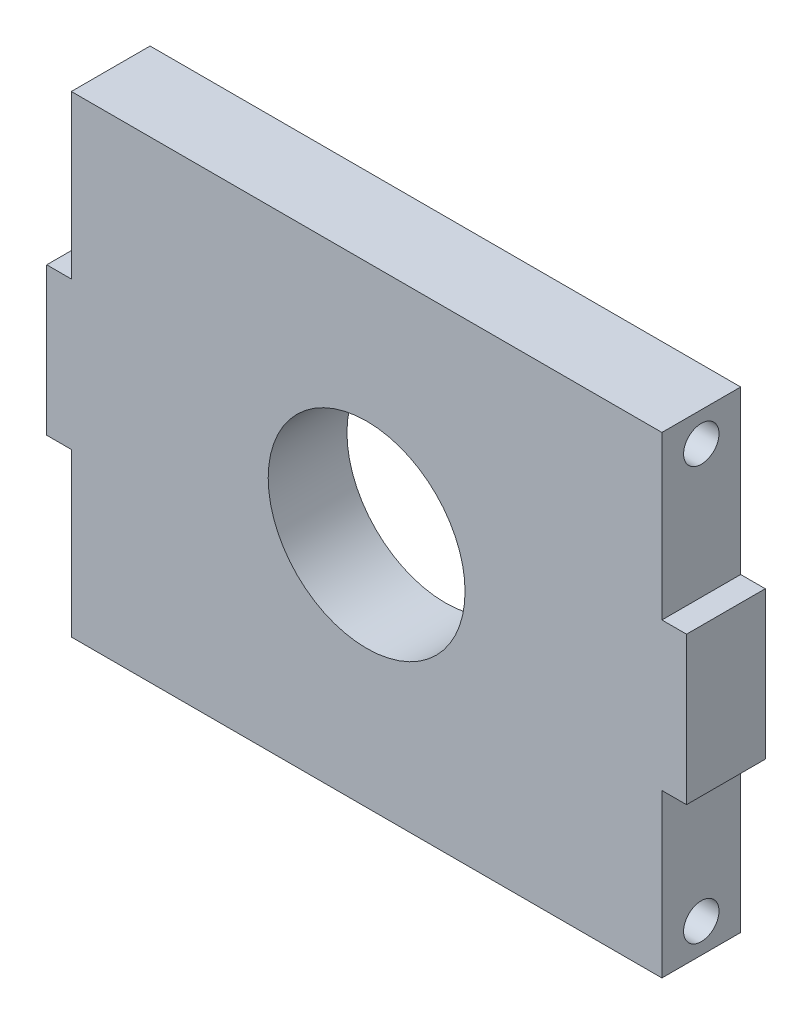
ISO-10303-21;
HEADER;
FILE_DESCRIPTION(('STEP AP214'),'2;1');
FILE_NAME('part.step','',(''),(''),'','','');
FILE_SCHEMA(('AUTOMOTIVE_DESIGN { 1 0 10303 214 1 1 1 1 }'));
ENDSEC;
DATA;
#1=APPLICATION_CONTEXT('core data for automotive mechanical design processes');
#2=APPLICATION_PROTOCOL_DEFINITION('international standard','automotive_design',2000,#1);
#3=PRODUCT_CONTEXT('',#1,'mechanical');
#4=PRODUCT('Part','Part','',(#3));
#5=PRODUCT_RELATED_PRODUCT_CATEGORY('part','',(#4));
#6=PRODUCT_DEFINITION_FORMATION('','',#4);
#7=PRODUCT_DEFINITION_CONTEXT('part definition',#1,'design');
#8=PRODUCT_DEFINITION('design','',#6,#7);
#9=PRODUCT_DEFINITION_SHAPE('','',#8);
#10=(LENGTH_UNIT() NAMED_UNIT(*) SI_UNIT(.MILLI.,.METRE.));
#11=(NAMED_UNIT(*) PLANE_ANGLE_UNIT() SI_UNIT($,.RADIAN.));
#12=(NAMED_UNIT(*) SI_UNIT($,.STERADIAN.) SOLID_ANGLE_UNIT());
#13=UNCERTAINTY_MEASURE_WITH_UNIT(LENGTH_MEASURE(1.E-05),#10,'distance_accuracy_value','');
#14=(GEOMETRIC_REPRESENTATION_CONTEXT(3) GLOBAL_UNCERTAINTY_ASSIGNED_CONTEXT((#13)) GLOBAL_UNIT_ASSIGNED_CONTEXT((#10,
#11,#12)) REPRESENTATION_CONTEXT('',''));
#15=CARTESIAN_POINT('',(0.,0.,0.));
#16=DIRECTION('',(0.,0.,1.));
#17=DIRECTION('',(1.,0.,0.));
#18=AXIS2_PLACEMENT_3D('',#15,#16,#17);
#19=CARTESIAN_POINT('',(30.,24.,8.));
#20=DIRECTION('',(1.,0.,0.));
#21=DIRECTION('',(0.,1.,0.));
#22=AXIS2_PLACEMENT_3D('',#19,#20,#21);
#23=PLANE('',#22);
#24=CARTESIAN_POINT('',(30.,-21.,4.));
#25=DIRECTION('',(-1.,0.,0.));
#26=DIRECTION('',(0.,0.,-1.));
#27=AXIS2_PLACEMENT_3D('',#24,#25,#26);
#28=CIRCLE('',#27,1.8);
#29=CARTESIAN_POINT('',(30.,-21.,2.2));
#30=VERTEX_POINT('',#29);
#31=EDGE_CURVE('E275',#30,#30,#28,.T.);
#32=ORIENTED_EDGE('',*,*,#31,.T.);
#33=EDGE_LOOP('',(#32));
#34=FACE_BOUND('',#33,.T.);
#35=DIRECTION('',(0.,0.,-1.));
#36=VECTOR('',#35,1.);
#37=CARTESIAN_POINT('',(30.,-7.5,8.));
#38=LINE('',#37,#36);
#39=CARTESIAN_POINT('',(30.,-7.5,8.));
#40=VERTEX_POINT('',#39);
#41=CARTESIAN_POINT('',(30.,-7.5,0.));
#42=VERTEX_POINT('',#41);
#43=EDGE_CURVE('E195',#40,#42,#38,.T.);
#44=ORIENTED_EDGE('',*,*,#43,.F.);
#45=DIRECTION('',(0.,-1.,0.));
#46=VECTOR('',#45,1.);
#47=CARTESIAN_POINT('',(30.,24.,8.));
#48=LINE('',#47,#46);
#49=CARTESIAN_POINT('',(30.,-24.,8.));
#50=VERTEX_POINT('',#49);
#51=EDGE_CURVE('E201',#40,#50,#48,.T.);
#52=ORIENTED_EDGE('',*,*,#51,.T.);
#53=DIRECTION('',(0.,0.,-1.));
#54=VECTOR('',#53,1.);
#55=CARTESIAN_POINT('',(30.,-24.,8.));
#56=LINE('',#55,#54);
#57=CARTESIAN_POINT('',(30.,-24.,0.));
#58=VERTEX_POINT('',#57);
#59=EDGE_CURVE('E48',#50,#58,#56,.T.);
#60=ORIENTED_EDGE('',*,*,#59,.T.);
#61=DIRECTION('',(0.,-1.,0.));
#62=VECTOR('',#61,1.);
#63=CARTESIAN_POINT('',(30.,24.,0.));
#64=LINE('',#63,#62);
#65=EDGE_CURVE('E198',#42,#58,#64,.T.);
#66=ORIENTED_EDGE('',*,*,#65,.F.);
#67=EDGE_LOOP('',(#44,#52,#60,#66));
#68=FACE_BOUND('',#67,.T.);
#69=ADVANCED_FACE('F44',(#34,#68),#23,.T.);
#70=CARTESIAN_POINT('',(-30.,24.,8.));
#71=DIRECTION('',(1.,0.,0.));
#72=DIRECTION('',(0.,1.,0.));
#73=AXIS2_PLACEMENT_3D('',#70,#71,#72);
#74=PLANE('',#73);
#75=CARTESIAN_POINT('',(-30.,-21.,4.));
#76=DIRECTION('',(-1.,0.,0.));
#77=DIRECTION('',(0.,0.,-1.));
#78=AXIS2_PLACEMENT_3D('',#75,#76,#77);
#79=CIRCLE('',#78,1.8);
#80=CARTESIAN_POINT('',(-30.,-21.,2.2));
#81=VERTEX_POINT('',#80);
#82=EDGE_CURVE('E283',#81,#81,#79,.T.);
#83=ORIENTED_EDGE('',*,*,#82,.F.);
#84=EDGE_LOOP('',(#83));
#85=FACE_BOUND('',#84,.T.);
#86=DIRECTION('',(0.,-1.,0.));
#87=VECTOR('',#86,1.);
#88=CARTESIAN_POINT('',(-30.,24.,8.));
#89=LINE('',#88,#87);
#90=CARTESIAN_POINT('',(-30.,-7.5,8.));
#91=VERTEX_POINT('',#90);
#92=CARTESIAN_POINT('',(-30.,-24.,8.));
#93=VERTEX_POINT('',#92);
#94=EDGE_CURVE('E204',#91,#93,#89,.T.);
#95=ORIENTED_EDGE('',*,*,#94,.F.);
#96=DIRECTION('',(0.,0.,-1.));
#97=VECTOR('',#96,1.);
#98=CARTESIAN_POINT('',(-30.,-7.5,8.));
#99=LINE('',#98,#97);
#100=CARTESIAN_POINT('',(-30.,-7.5,0.));
#101=VERTEX_POINT('',#100);
#102=EDGE_CURVE('E192',#91,#101,#99,.T.);
#103=ORIENTED_EDGE('',*,*,#102,.T.);
#104=DIRECTION('',(0.,-1.,0.));
#105=VECTOR('',#104,1.);
#106=CARTESIAN_POINT('',(-30.,24.,0.));
#107=LINE('',#106,#105);
#108=CARTESIAN_POINT('',(-30.,-24.,0.));
#109=VERTEX_POINT('',#108);
#110=EDGE_CURVE('E214',#101,#109,#107,.T.);
#111=ORIENTED_EDGE('',*,*,#110,.T.);
#112=DIRECTION('',(0.,0.,-1.));
#113=VECTOR('',#112,1.);
#114=CARTESIAN_POINT('',(-30.,-24.,8.));
#115=LINE('',#114,#113);
#116=EDGE_CURVE('E221',#93,#109,#115,.T.);
#117=ORIENTED_EDGE('',*,*,#116,.F.);
#118=EDGE_LOOP('',(#95,#103,#111,#117));
#119=FACE_BOUND('',#118,.T.);
#120=ADVANCED_FACE('F240',(#85,#119),#74,.F.);
#121=CARTESIAN_POINT('',(30.,21.,4.));
#122=DIRECTION('',(1.,0.,0.));
#123=DIRECTION('',(0.,0.,-1.));
#124=AXIS2_PLACEMENT_3D('',#121,#122,#123);
#125=CIRCLE('',#124,1.8);
#126=CARTESIAN_POINT('',(30.,21.,2.2));
#127=VERTEX_POINT('',#126);
#128=EDGE_CURVE('E168',#127,#127,#125,.T.);
#129=ORIENTED_EDGE('',*,*,#128,.F.);
#130=EDGE_LOOP('',(#129));
#131=FACE_BOUND('',#130,.T.);
#132=DIRECTION('',(0.,0.,1.));
#133=VECTOR('',#132,1.);
#134=CARTESIAN_POINT('',(30.,7.5,8.));
#135=LINE('',#134,#133);
#136=CARTESIAN_POINT('',(30.,7.5,0.));
#137=VERTEX_POINT('',#136);
#138=CARTESIAN_POINT('',(30.,7.5,8.));
#139=VERTEX_POINT('',#138);
#140=EDGE_CURVE('E190',#137,#139,#135,.T.);
#141=ORIENTED_EDGE('',*,*,#140,.F.);
#142=CARTESIAN_POINT('',(30.,24.,0.));
#143=VERTEX_POINT('',#142);
#144=EDGE_CURVE('E156',#143,#137,#64,.T.);
#145=ORIENTED_EDGE('',*,*,#144,.F.);
#146=DIRECTION('',(0.,0.,-1.));
#147=VECTOR('',#146,1.);
#148=CARTESIAN_POINT('',(30.,24.,8.));
#149=LINE('',#148,#147);
#150=CARTESIAN_POINT('',(30.,24.,8.));
#151=VERTEX_POINT('',#150);
#152=EDGE_CURVE('E11',#151,#143,#149,.T.);
#153=ORIENTED_EDGE('',*,*,#152,.F.);
#154=EDGE_CURVE('E69',#151,#139,#48,.T.);
#155=ORIENTED_EDGE('',*,*,#154,.T.);
#156=EDGE_LOOP('',(#141,#145,#153,#155));
#157=FACE_BOUND('',#156,.T.);
#158=ADVANCED_FACE('F46',(#131,#157),#23,.T.);
#159=CARTESIAN_POINT('',(30.,24.,8.));
#160=DIRECTION('',(0.,-1.,0.));
#161=DIRECTION('',(1.,0.,0.));
#162=AXIS2_PLACEMENT_3D('',#159,#160,#161);
#163=PLANE('',#162);
#164=DIRECTION('',(-1.,0.,0.));
#165=VECTOR('',#164,1.);
#166=CARTESIAN_POINT('',(30.,24.,0.));
#167=LINE('',#166,#165);
#168=CARTESIAN_POINT('',(-30.,24.,0.));
#169=VERTEX_POINT('',#168);
#170=EDGE_CURVE('E218',#143,#169,#167,.T.);
#171=ORIENTED_EDGE('',*,*,#170,.T.);
#172=DIRECTION('',(0.,0.,-1.));
#173=VECTOR('',#172,1.);
#174=CARTESIAN_POINT('',(-30.,24.,8.));
#175=LINE('',#174,#173);
#176=CARTESIAN_POINT('',(-30.,24.,8.));
#177=VERTEX_POINT('',#176);
#178=EDGE_CURVE('E53',#177,#169,#175,.T.);
#179=ORIENTED_EDGE('',*,*,#178,.F.);
#180=DIRECTION('',(-1.,0.,0.));
#181=VECTOR('',#180,1.);
#182=CARTESIAN_POINT('',(30.,24.,8.));
#183=LINE('',#182,#181);
#184=EDGE_CURVE('E208',#151,#177,#183,.T.);
#185=ORIENTED_EDGE('',*,*,#184,.F.);
#186=ORIENTED_EDGE('',*,*,#152,.T.);
#187=EDGE_LOOP('',(#171,#179,#185,#186));
#188=FACE_BOUND('',#187,.T.);
#189=ADVANCED_FACE('F258',(#188),#163,.F.);
#190=CARTESIAN_POINT('',(-30.,21.,4.));
#191=DIRECTION('',(1.,0.,0.));
#192=DIRECTION('',(0.,0.,-1.));
#193=AXIS2_PLACEMENT_3D('',#190,#191,#192);
#194=CIRCLE('',#193,1.8);
#195=CARTESIAN_POINT('',(-30.,21.,2.2));
#196=VERTEX_POINT('',#195);
#197=EDGE_CURVE('E539',#196,#196,#194,.T.);
#198=ORIENTED_EDGE('',*,*,#197,.T.);
#199=EDGE_LOOP('',(#198));
#200=FACE_BOUND('',#199,.T.);
#201=CARTESIAN_POINT('',(-30.,7.5,0.));
#202=VERTEX_POINT('',#201);
#203=EDGE_CURVE('E215',#169,#202,#107,.T.);
#204=ORIENTED_EDGE('',*,*,#203,.T.);
#205=DIRECTION('',(0.,0.,1.));
#206=VECTOR('',#205,1.);
#207=CARTESIAN_POINT('',(-30.,7.5,8.));
#208=LINE('',#207,#206);
#209=CARTESIAN_POINT('',(-30.,7.5,8.));
#210=VERTEX_POINT('',#209);
#211=EDGE_CURVE('E183',#202,#210,#208,.T.);
#212=ORIENTED_EDGE('',*,*,#211,.T.);
#213=EDGE_CURVE('E205',#177,#210,#89,.T.);
#214=ORIENTED_EDGE('',*,*,#213,.F.);
#215=ORIENTED_EDGE('',*,*,#178,.T.);
#216=EDGE_LOOP('',(#204,#212,#214,#215));
#217=FACE_BOUND('',#216,.T.);
#218=ADVANCED_FACE('F254',(#200,#217),#74,.F.);
#219=CARTESIAN_POINT('',(30.,-24.,8.));
#220=DIRECTION('',(0.,-1.,0.));
#221=DIRECTION('',(1.,0.,0.));
#222=AXIS2_PLACEMENT_3D('',#219,#220,#221);
#223=PLANE('',#222);
#224=DIRECTION('',(-1.,0.,0.));
#225=VECTOR('',#224,1.);
#226=CARTESIAN_POINT('',(30.,-24.,0.));
#227=LINE('',#226,#225);
#228=EDGE_CURVE('E211',#58,#109,#227,.T.);
#229=ORIENTED_EDGE('',*,*,#228,.F.);
#230=ORIENTED_EDGE('',*,*,#59,.F.);
#231=DIRECTION('',(-1.,0.,0.));
#232=VECTOR('',#231,1.);
#233=CARTESIAN_POINT('',(30.,-24.,8.));
#234=LINE('',#233,#232);
#235=EDGE_CURVE('E200',#50,#93,#234,.T.);
#236=ORIENTED_EDGE('',*,*,#235,.T.);
#237=ORIENTED_EDGE('',*,*,#116,.T.);
#238=EDGE_LOOP('',(#229,#230,#236,#237));
#239=FACE_BOUND('',#238,.T.);
#240=ADVANCED_FACE('F231',(#239),#223,.T.);
#241=CARTESIAN_POINT('',(0.,0.,8.));
#242=DIRECTION('',(0.,0.,-1.));
#243=DIRECTION('',(-1.,0.,0.));
#244=AXIS2_PLACEMENT_3D('',#241,#242,#243);
#245=PLANE('',#244);
#246=CARTESIAN_POINT('',(0.,0.,8.));
#247=DIRECTION('',(0.,0.,1.));
#248=DIRECTION('',(1.,0.,0.));
#249=AXIS2_PLACEMENT_3D('',#246,#247,#248);
#250=CIRCLE('',#249,10.);
#251=CARTESIAN_POINT('',(10.,0.,8.));
#252=VERTEX_POINT('',#251);
#253=EDGE_CURVE('E537',#252,#252,#250,.T.);
#254=ORIENTED_EDGE('',*,*,#253,.F.);
#255=EDGE_LOOP('',(#254));
#256=FACE_BOUND('',#255,.T.);
#257=ORIENTED_EDGE('',*,*,#213,.T.);
#258=DIRECTION('',(-1.,0.,0.));
#259=VECTOR('',#258,1.);
#260=CARTESIAN_POINT('',(-32.5,7.5,8.));
#261=LINE('',#260,#259);
#262=CARTESIAN_POINT('',(-32.5,7.5,8.));
#263=VERTEX_POINT('',#262);
#264=EDGE_CURVE('E177',#210,#263,#261,.T.);
#265=ORIENTED_EDGE('',*,*,#264,.T.);
#266=DIRECTION('',(0.,-1.,0.));
#267=VECTOR('',#266,1.);
#268=CARTESIAN_POINT('',(-32.5,7.5,8.));
#269=LINE('',#268,#267);
#270=CARTESIAN_POINT('',(-32.5,-7.5,8.));
#271=VERTEX_POINT('',#270);
#272=EDGE_CURVE('E180',#263,#271,#269,.T.);
#273=ORIENTED_EDGE('',*,*,#272,.T.);
#274=DIRECTION('',(1.,0.,0.));
#275=VECTOR('',#274,1.);
#276=CARTESIAN_POINT('',(-32.5,-7.5,8.));
#277=LINE('',#276,#275);
#278=EDGE_CURVE('E61',#271,#91,#277,.T.);
#279=ORIENTED_EDGE('',*,*,#278,.T.);
#280=ORIENTED_EDGE('',*,*,#94,.T.);
#281=ORIENTED_EDGE('',*,*,#235,.F.);
#282=ORIENTED_EDGE('',*,*,#51,.F.);
#283=CARTESIAN_POINT('',(32.5,-7.5,8.));
#284=VERTEX_POINT('',#283);
#285=EDGE_CURVE('E165',#40,#284,#277,.T.);
#286=ORIENTED_EDGE('',*,*,#285,.T.);
#287=DIRECTION('',(0.,1.,0.));
#288=VECTOR('',#287,1.);
#289=CARTESIAN_POINT('',(32.5,7.5,8.));
#290=LINE('',#289,#288);
#291=CARTESIAN_POINT('',(32.5,7.5,8.));
#292=VERTEX_POINT('',#291);
#293=EDGE_CURVE('E175',#284,#292,#290,.T.);
#294=ORIENTED_EDGE('',*,*,#293,.T.);
#295=EDGE_CURVE('E140',#292,#139,#261,.T.);
#296=ORIENTED_EDGE('',*,*,#295,.T.);
#297=ORIENTED_EDGE('',*,*,#154,.F.);
#298=ORIENTED_EDGE('',*,*,#184,.T.);
#299=EDGE_LOOP('',(#257,#265,#273,#279,#280,#281,#282,#286,#294,#296,#297,#298));
#300=FACE_BOUND('',#299,.T.);
#301=ADVANCED_FACE('F237',(#256,#300),#245,.F.);
#302=CARTESIAN_POINT('',(0.,0.,0.));
#303=DIRECTION('',(0.,0.,-1.));
#304=DIRECTION('',(-1.,0.,0.));
#305=AXIS2_PLACEMENT_3D('',#302,#303,#304);
#306=PLANE('',#305);
#307=CARTESIAN_POINT('',(0.,0.,0.));
#308=DIRECTION('',(0.,0.,1.));
#309=DIRECTION('',(1.,0.,0.));
#310=AXIS2_PLACEMENT_3D('',#307,#308,#309);
#311=CIRCLE('',#310,10.);
#312=CARTESIAN_POINT('',(10.,0.,0.));
#313=VERTEX_POINT('',#312);
#314=EDGE_CURVE('E534',#313,#313,#311,.T.);
#315=ORIENTED_EDGE('',*,*,#314,.T.);
#316=EDGE_LOOP('',(#315));
#317=FACE_BOUND('',#316,.T.);
#318=ORIENTED_EDGE('',*,*,#144,.T.);
#319=DIRECTION('',(-1.,0.,0.));
#320=VECTOR('',#319,1.);
#321=CARTESIAN_POINT('',(-32.5,7.5,0.));
#322=LINE('',#321,#320);
#323=CARTESIAN_POINT('',(32.5,7.5,0.));
#324=VERTEX_POINT('',#323);
#325=EDGE_CURVE('E138',#324,#137,#322,.T.);
#326=ORIENTED_EDGE('',*,*,#325,.F.);
#327=DIRECTION('',(0.,1.,0.));
#328=VECTOR('',#327,1.);
#329=CARTESIAN_POINT('',(32.5,7.5,0.));
#330=LINE('',#329,#328);
#331=CARTESIAN_POINT('',(32.5,-7.5,0.));
#332=VERTEX_POINT('',#331);
#333=EDGE_CURVE('E153',#332,#324,#330,.T.);
#334=ORIENTED_EDGE('',*,*,#333,.F.);
#335=DIRECTION('',(1.,0.,0.));
#336=VECTOR('',#335,1.);
#337=CARTESIAN_POINT('',(-32.5,-7.5,0.));
#338=LINE('',#337,#336);
#339=EDGE_CURVE('E173',#42,#332,#338,.T.);
#340=ORIENTED_EDGE('',*,*,#339,.F.);
#341=ORIENTED_EDGE('',*,*,#65,.T.);
#342=ORIENTED_EDGE('',*,*,#228,.T.);
#343=ORIENTED_EDGE('',*,*,#110,.F.);
#344=CARTESIAN_POINT('',(-32.5,-7.5,0.));
#345=VERTEX_POINT('',#344);
#346=EDGE_CURVE('E146',#345,#101,#338,.T.);
#347=ORIENTED_EDGE('',*,*,#346,.F.);
#348=DIRECTION('',(0.,-1.,0.));
#349=VECTOR('',#348,1.);
#350=CARTESIAN_POINT('',(-32.5,7.5,0.));
#351=LINE('',#350,#349);
#352=CARTESIAN_POINT('',(-32.5,7.5,0.));
#353=VERTEX_POINT('',#352);
#354=EDGE_CURVE('E157',#353,#345,#351,.T.);
#355=ORIENTED_EDGE('',*,*,#354,.F.);
#356=EDGE_CURVE('E158',#202,#353,#322,.T.);
#357=ORIENTED_EDGE('',*,*,#356,.F.);
#358=ORIENTED_EDGE('',*,*,#203,.F.);
#359=ORIENTED_EDGE('',*,*,#170,.F.);
#360=EDGE_LOOP('',(#318,#326,#334,#340,#341,#342,#343,#347,#355,#357,#358,#359));
#361=FACE_BOUND('',#360,.T.);
#362=ADVANCED_FACE('F151',(#317,#361),#306,.T.);
#363=CARTESIAN_POINT('',(-32.5,7.5,0.));
#364=DIRECTION('',(-1.,0.,0.));
#365=DIRECTION('',(0.,0.,1.));
#366=AXIS2_PLACEMENT_3D('',#363,#364,#365);
#367=PLANE('',#366);
#368=ORIENTED_EDGE('',*,*,#272,.F.);
#369=DIRECTION('',(0.,0.,1.));
#370=VECTOR('',#369,1.);
#371=CARTESIAN_POINT('',(-32.5,7.5,0.));
#372=LINE('',#371,#370);
#373=EDGE_CURVE('E145',#353,#263,#372,.T.);
#374=ORIENTED_EDGE('',*,*,#373,.F.);
#375=ORIENTED_EDGE('',*,*,#354,.T.);
#376=DIRECTION('',(0.,0.,1.));
#377=VECTOR('',#376,1.);
#378=CARTESIAN_POINT('',(-32.5,-7.5,0.));
#379=LINE('',#378,#377);
#380=EDGE_CURVE('E184',#345,#271,#379,.T.);
#381=ORIENTED_EDGE('',*,*,#380,.T.);
#382=EDGE_LOOP('',(#368,#374,#375,#381));
#383=FACE_BOUND('',#382,.T.);
#384=ADVANCED_FACE('F249',(#383),#367,.T.);
#385=CARTESIAN_POINT('',(-32.5,7.5,0.));
#386=DIRECTION('',(0.,1.,0.));
#387=DIRECTION('',(0.,0.,1.));
#388=AXIS2_PLACEMENT_3D('',#385,#386,#387);
#389=PLANE('',#388);
#390=ORIENTED_EDGE('',*,*,#211,.F.);
#391=ORIENTED_EDGE('',*,*,#356,.T.);
#392=ORIENTED_EDGE('',*,*,#373,.T.);
#393=ORIENTED_EDGE('',*,*,#264,.F.);
#394=EDGE_LOOP('',(#390,#391,#392,#393));
#395=FACE_BOUND('',#394,.T.);
#396=ADVANCED_FACE('F251',(#395),#389,.T.);
#397=CARTESIAN_POINT('',(-32.5,-7.5,0.));
#398=DIRECTION('',(0.,-1.,0.));
#399=DIRECTION('',(0.,0.,-1.));
#400=AXIS2_PLACEMENT_3D('',#397,#398,#399);
#401=PLANE('',#400);
#402=ORIENTED_EDGE('',*,*,#102,.F.);
#403=ORIENTED_EDGE('',*,*,#278,.F.);
#404=ORIENTED_EDGE('',*,*,#380,.F.);
#405=ORIENTED_EDGE('',*,*,#346,.T.);
#406=EDGE_LOOP('',(#402,#403,#404,#405));
#407=FACE_BOUND('',#406,.T.);
#408=ADVANCED_FACE('F242',(#407),#401,.T.);
#409=CARTESIAN_POINT('',(32.5,7.5,0.));
#410=DIRECTION('',(1.,0.,0.));
#411=DIRECTION('',(0.,0.,-1.));
#412=AXIS2_PLACEMENT_3D('',#409,#410,#411);
#413=PLANE('',#412);
#414=ORIENTED_EDGE('',*,*,#293,.F.);
#415=DIRECTION('',(0.,0.,1.));
#416=VECTOR('',#415,1.);
#417=CARTESIAN_POINT('',(32.5,-7.5,0.));
#418=LINE('',#417,#416);
#419=EDGE_CURVE('E163',#332,#284,#418,.T.);
#420=ORIENTED_EDGE('',*,*,#419,.F.);
#421=ORIENTED_EDGE('',*,*,#333,.T.);
#422=DIRECTION('',(0.,0.,1.));
#423=VECTOR('',#422,1.);
#424=CARTESIAN_POINT('',(32.5,7.5,0.));
#425=LINE('',#424,#423);
#426=EDGE_CURVE('E135',#324,#292,#425,.T.);
#427=ORIENTED_EDGE('',*,*,#426,.T.);
#428=EDGE_LOOP('',(#414,#420,#421,#427));
#429=FACE_BOUND('',#428,.T.);
#430=ADVANCED_FACE('F161',(#429),#413,.T.);
#431=ORIENTED_EDGE('',*,*,#285,.F.);
#432=ORIENTED_EDGE('',*,*,#43,.T.);
#433=ORIENTED_EDGE('',*,*,#339,.T.);
#434=ORIENTED_EDGE('',*,*,#419,.T.);
#435=EDGE_LOOP('',(#431,#432,#433,#434));
#436=FACE_BOUND('',#435,.T.);
#437=ADVANCED_FACE('F236',(#436),#401,.T.);
#438=ORIENTED_EDGE('',*,*,#325,.T.);
#439=ORIENTED_EDGE('',*,*,#140,.T.);
#440=ORIENTED_EDGE('',*,*,#295,.F.);
#441=ORIENTED_EDGE('',*,*,#426,.F.);
#442=EDGE_LOOP('',(#438,#439,#440,#441));
#443=FACE_BOUND('',#442,.T.);
#444=ADVANCED_FACE('F137',(#443),#389,.T.);
#445=CARTESIAN_POINT('',(27.,21.,4.));
#446=DIRECTION('',(1.,0.,0.));
#447=DIRECTION('',(0.,0.,-1.));
#448=AXIS2_PLACEMENT_3D('',#445,#446,#447);
#449=CYLINDRICAL_SURFACE('',#448,1.8);
#450=CARTESIAN_POINT('',(27.,21.,4.));
#451=DIRECTION('',(1.,0.,0.));
#452=DIRECTION('',(0.,0.,-1.));
#453=AXIS2_PLACEMENT_3D('',#450,#451,#452);
#454=CIRCLE('',#453,1.8);
#455=CARTESIAN_POINT('',(27.,21.,2.2));
#456=VERTEX_POINT('',#455);
#457=EDGE_CURVE('E178',#456,#456,#454,.T.);
#458=ORIENTED_EDGE('',*,*,#457,.F.);
#459=EDGE_LOOP('',(#458));
#460=FACE_BOUND('',#459,.T.);
#461=ORIENTED_EDGE('',*,*,#128,.T.);
#462=EDGE_LOOP('',(#461));
#463=FACE_BOUND('',#462,.T.);
#464=ADVANCED_FACE('F291',(#460,#463),#449,.F.);
#465=CARTESIAN_POINT('',(27.,21.,4.));
#466=DIRECTION('',(1.,0.,0.));
#467=DIRECTION('',(0.,0.,-1.));
#468=AXIS2_PLACEMENT_3D('',#465,#466,#467);
#469=PLANE('',#468);
#470=ORIENTED_EDGE('',*,*,#457,.T.);
#471=EDGE_LOOP('',(#470));
#472=FACE_BOUND('',#471,.T.);
#473=ADVANCED_FACE('F293',(#472),#469,.T.);
#474=CARTESIAN_POINT('',(27.,-21.,4.));
#475=DIRECTION('',(1.,0.,0.));
#476=DIRECTION('',(0.,0.,-1.));
#477=AXIS2_PLACEMENT_3D('',#474,#475,#476);
#478=CYLINDRICAL_SURFACE('',#477,1.8);
#479=CARTESIAN_POINT('',(27.,-21.,4.));
#480=DIRECTION('',(-1.,0.,0.));
#481=DIRECTION('',(0.,0.,-1.));
#482=AXIS2_PLACEMENT_3D('',#479,#480,#481);
#483=CIRCLE('',#482,1.8);
#484=CARTESIAN_POINT('',(27.,-21.,2.2));
#485=VERTEX_POINT('',#484);
#486=EDGE_CURVE('E277',#485,#485,#483,.T.);
#487=ORIENTED_EDGE('',*,*,#486,.T.);
#488=EDGE_LOOP('',(#487));
#489=FACE_BOUND('',#488,.T.);
#490=ORIENTED_EDGE('',*,*,#31,.F.);
#491=EDGE_LOOP('',(#490));
#492=FACE_BOUND('',#491,.T.);
#493=ADVANCED_FACE('F300',(#489,#492),#478,.F.);
#494=CARTESIAN_POINT('',(27.,-21.,4.));
#495=DIRECTION('',(1.,0.,0.));
#496=DIRECTION('',(0.,0.,-1.));
#497=AXIS2_PLACEMENT_3D('',#494,#495,#496);
#498=PLANE('',#497);
#499=ORIENTED_EDGE('',*,*,#486,.F.);
#500=EDGE_LOOP('',(#499));
#501=FACE_BOUND('',#500,.T.);
#502=ADVANCED_FACE('F394',(#501),#498,.T.);
#503=CARTESIAN_POINT('',(-27.,-21.,4.));
#504=DIRECTION('',(-1.,0.,0.));
#505=DIRECTION('',(0.,0.,1.));
#506=AXIS2_PLACEMENT_3D('',#503,#504,#505);
#507=CYLINDRICAL_SURFACE('',#506,1.8);
#508=CARTESIAN_POINT('',(-27.,-21.,4.));
#509=DIRECTION('',(-1.,0.,0.));
#510=DIRECTION('',(0.,0.,-1.));
#511=AXIS2_PLACEMENT_3D('',#508,#509,#510);
#512=CIRCLE('',#511,1.8);
#513=CARTESIAN_POINT('',(-27.,-21.,2.2));
#514=VERTEX_POINT('',#513);
#515=EDGE_CURVE('E278',#514,#514,#512,.T.);
#516=ORIENTED_EDGE('',*,*,#515,.F.);
#517=EDGE_LOOP('',(#516));
#518=FACE_BOUND('',#517,.T.);
#519=ORIENTED_EDGE('',*,*,#82,.T.);
#520=EDGE_LOOP('',(#519));
#521=FACE_BOUND('',#520,.T.);
#522=ADVANCED_FACE('F404',(#518,#521),#507,.F.);
#523=CARTESIAN_POINT('',(-27.,-21.,4.));
#524=DIRECTION('',(-1.,0.,0.));
#525=DIRECTION('',(0.,0.,-1.));
#526=AXIS2_PLACEMENT_3D('',#523,#524,#525);
#527=PLANE('',#526);
#528=ORIENTED_EDGE('',*,*,#515,.T.);
#529=EDGE_LOOP('',(#528));
#530=FACE_BOUND('',#529,.T.);
#531=ADVANCED_FACE('F426',(#530),#527,.T.);
#532=CARTESIAN_POINT('',(-27.,21.,4.));
#533=DIRECTION('',(-1.,0.,0.));
#534=DIRECTION('',(0.,0.,1.));
#535=AXIS2_PLACEMENT_3D('',#532,#533,#534);
#536=CYLINDRICAL_SURFACE('',#535,1.8);
#537=CARTESIAN_POINT('',(-27.,21.,4.));
#538=DIRECTION('',(1.,0.,0.));
#539=DIRECTION('',(0.,0.,-1.));
#540=AXIS2_PLACEMENT_3D('',#537,#538,#539);
#541=CIRCLE('',#540,1.8);
#542=CARTESIAN_POINT('',(-27.,21.,2.2));
#543=VERTEX_POINT('',#542);
#544=EDGE_CURVE('E542',#543,#543,#541,.T.);
#545=ORIENTED_EDGE('',*,*,#544,.T.);
#546=EDGE_LOOP('',(#545));
#547=FACE_BOUND('',#546,.T.);
#548=ORIENTED_EDGE('',*,*,#197,.F.);
#549=EDGE_LOOP('',(#548));
#550=FACE_BOUND('',#549,.T.);
#551=ADVANCED_FACE('F437',(#547,#550),#536,.F.);
#552=CARTESIAN_POINT('',(-27.,21.,4.));
#553=DIRECTION('',(-1.,0.,0.));
#554=DIRECTION('',(0.,0.,-1.));
#555=AXIS2_PLACEMENT_3D('',#552,#553,#554);
#556=PLANE('',#555);
#557=ORIENTED_EDGE('',*,*,#544,.F.);
#558=EDGE_LOOP('',(#557));
#559=FACE_BOUND('',#558,.T.);
#560=ADVANCED_FACE('F447',(#559),#556,.T.);
#561=CARTESIAN_POINT('',(0.,0.,0.));
#562=DIRECTION('',(0.,0.,1.));
#563=DIRECTION('',(1.,0.,0.));
#564=AXIS2_PLACEMENT_3D('',#561,#562,#563);
#565=CYLINDRICAL_SURFACE('',#564,10.);
#566=ORIENTED_EDGE('',*,*,#314,.F.);
#567=EDGE_LOOP('',(#566));
#568=FACE_BOUND('',#567,.T.);
#569=ORIENTED_EDGE('',*,*,#253,.T.);
#570=EDGE_LOOP('',(#569));
#571=FACE_BOUND('',#570,.T.);
#572=ADVANCED_FACE('F457',(#568,#571),#565,.F.);
#573=CLOSED_SHELL('',(#69,#120,#158,#189,#218,#240,#301,#362,#384,#396,#408,#430,#437,#444,#464,
#473,#493,#502,#522,#531,#551,#560,#572));
#574=MANIFOLD_SOLID_BREP('B2',#573);
#575=ADVANCED_BREP_SHAPE_REPRESENTATION('',(#18,#574),#14);
#576=SHAPE_DEFINITION_REPRESENTATION(#9,#575);
ENDSEC;
END-ISO-10303-21;
